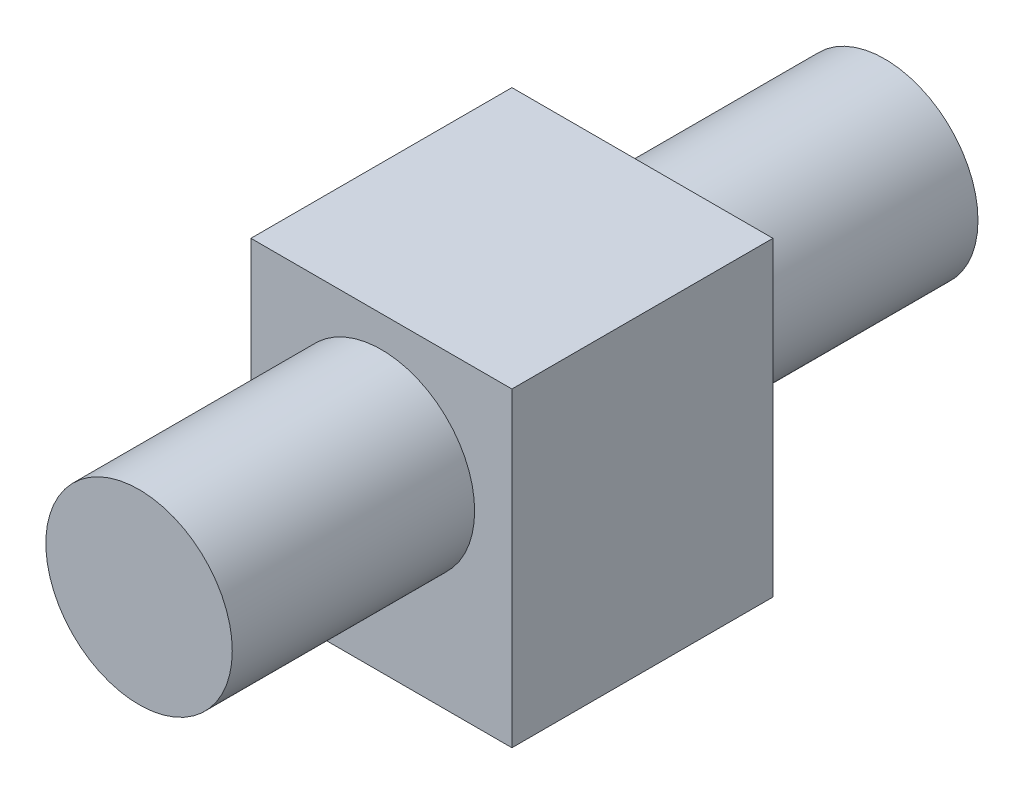
ISO-10303-21;
HEADER;
FILE_DESCRIPTION(('STEP AP214'),'2;1');
FILE_NAME('part.step','',(''),(''),'','','');
FILE_SCHEMA(('AUTOMOTIVE_DESIGN { 1 0 10303 214 1 1 1 1 }'));
ENDSEC;
DATA;
#1=APPLICATION_CONTEXT('core data for automotive mechanical design processes');
#2=APPLICATION_PROTOCOL_DEFINITION('international standard','automotive_design',2000,#1);
#3=PRODUCT_CONTEXT('',#1,'mechanical');
#4=PRODUCT('Part','Part','',(#3));
#5=PRODUCT_RELATED_PRODUCT_CATEGORY('part','',(#4));
#6=PRODUCT_DEFINITION_FORMATION('','',#4);
#7=PRODUCT_DEFINITION_CONTEXT('part definition',#1,'design');
#8=PRODUCT_DEFINITION('design','',#6,#7);
#9=PRODUCT_DEFINITION_SHAPE('','',#8);
#10=(LENGTH_UNIT() NAMED_UNIT(*) SI_UNIT(.MILLI.,.METRE.));
#11=(NAMED_UNIT(*) PLANE_ANGLE_UNIT() SI_UNIT($,.RADIAN.));
#12=(NAMED_UNIT(*) SI_UNIT($,.STERADIAN.) SOLID_ANGLE_UNIT());
#13=UNCERTAINTY_MEASURE_WITH_UNIT(LENGTH_MEASURE(1.E-05),#10,'distance_accuracy_value','');
#14=(GEOMETRIC_REPRESENTATION_CONTEXT(3) GLOBAL_UNCERTAINTY_ASSIGNED_CONTEXT((#13)) GLOBAL_UNIT_ASSIGNED_CONTEXT((#10,
#11,#12)) REPRESENTATION_CONTEXT('',''));
#15=CARTESIAN_POINT('',(0.,0.,0.));
#16=DIRECTION('',(0.,0.,1.));
#17=DIRECTION('',(1.,0.,0.));
#18=AXIS2_PLACEMENT_3D('',#15,#16,#17);
#19=CARTESIAN_POINT('',(21.,50.,21.));
#20=DIRECTION('',(-1.,0.,0.));
#21=DIRECTION('',(0.,0.,1.));
#22=AXIS2_PLACEMENT_3D('',#19,#20,#21);
#23=PLANE('',#22);
#24=DIRECTION('',(0.,0.,-1.));
#25=VECTOR('',#24,1.);
#26=CARTESIAN_POINT('',(21.,0.,21.));
#27=LINE('',#26,#25);
#28=CARTESIAN_POINT('',(21.,0.,21.));
#29=VERTEX_POINT('',#28);
#30=CARTESIAN_POINT('',(21.,0.,-21.));
#31=VERTEX_POINT('',#30);
#32=EDGE_CURVE('E102',#29,#31,#27,.T.);
#33=ORIENTED_EDGE('',*,*,#32,.T.);
#34=DIRECTION('',(0.,-1.,0.));
#35=VECTOR('',#34,1.);
#36=CARTESIAN_POINT('',(21.,50.,-21.));
#37=LINE('',#36,#35);
#38=CARTESIAN_POINT('',(21.,50.,-21.));
#39=VERTEX_POINT('',#38);
#40=EDGE_CURVE('E11',#39,#31,#37,.T.);
#41=ORIENTED_EDGE('',*,*,#40,.F.);
#42=DIRECTION('',(0.,0.,-1.));
#43=VECTOR('',#42,1.);
#44=CARTESIAN_POINT('',(21.,50.,21.));
#45=LINE('',#44,#43);
#46=CARTESIAN_POINT('',(21.,50.,21.));
#47=VERTEX_POINT('',#46);
#48=EDGE_CURVE('E93',#47,#39,#45,.T.);
#49=ORIENTED_EDGE('',*,*,#48,.F.);
#50=DIRECTION('',(0.,-1.,0.));
#51=VECTOR('',#50,1.);
#52=CARTESIAN_POINT('',(21.,50.,21.));
#53=LINE('',#52,#51);
#54=EDGE_CURVE('E99',#47,#29,#53,.T.);
#55=ORIENTED_EDGE('',*,*,#54,.T.);
#56=EDGE_LOOP('',(#33,#41,#49,#55));
#57=FACE_BOUND('',#56,.T.);
#58=ADVANCED_FACE('F39',(#57),#23,.F.);
#59=CARTESIAN_POINT('',(-21.,50.,-21.));
#60=DIRECTION('',(0.,0.,1.));
#61=DIRECTION('',(1.,0.,0.));
#62=AXIS2_PLACEMENT_3D('',#59,#60,#61);
#63=PLANE('',#62);
#64=CARTESIAN_POINT('',(0.,30.,-21.));
#65=DIRECTION('',(0.,0.,1.));
#66=DIRECTION('',(1.,0.,0.));
#67=AXIS2_PLACEMENT_3D('',#64,#65,#66);
#68=CIRCLE('',#67,15.);
#69=CARTESIAN_POINT('',(15.,30.,-21.));
#70=VERTEX_POINT('',#69);
#71=EDGE_CURVE('E110',#70,#70,#68,.T.);
#72=ORIENTED_EDGE('',*,*,#71,.T.);
#73=EDGE_LOOP('',(#72));
#74=FACE_BOUND('',#73,.T.);
#75=DIRECTION('',(-1.,0.,0.));
#76=VECTOR('',#75,1.);
#77=CARTESIAN_POINT('',(-21.,0.,-21.));
#78=LINE('',#77,#76);
#79=CARTESIAN_POINT('',(-21.,0.,-21.));
#80=VERTEX_POINT('',#79);
#81=EDGE_CURVE('E92',#31,#80,#78,.T.);
#82=ORIENTED_EDGE('',*,*,#81,.T.);
#83=DIRECTION('',(0.,-1.,0.));
#84=VECTOR('',#83,1.);
#85=CARTESIAN_POINT('',(-21.,50.,-21.));
#86=LINE('',#85,#84);
#87=CARTESIAN_POINT('',(-21.,50.,-21.));
#88=VERTEX_POINT('',#87);
#89=EDGE_CURVE('E48',#88,#80,#86,.T.);
#90=ORIENTED_EDGE('',*,*,#89,.F.);
#91=DIRECTION('',(-1.,0.,0.));
#92=VECTOR('',#91,1.);
#93=CARTESIAN_POINT('',(-21.,50.,-21.));
#94=LINE('',#93,#92);
#95=EDGE_CURVE('E88',#39,#88,#94,.T.);
#96=ORIENTED_EDGE('',*,*,#95,.F.);
#97=ORIENTED_EDGE('',*,*,#40,.T.);
#98=EDGE_LOOP('',(#82,#90,#96,#97));
#99=FACE_BOUND('',#98,.T.);
#100=ADVANCED_FACE('F94',(#74,#99),#63,.F.);
#101=CARTESIAN_POINT('',(-21.,50.,21.));
#102=DIRECTION('',(1.,0.,0.));
#103=DIRECTION('',(0.,0.,-1.));
#104=AXIS2_PLACEMENT_3D('',#101,#102,#103);
#105=PLANE('',#104);
#106=DIRECTION('',(0.,0.,1.));
#107=VECTOR('',#106,1.);
#108=CARTESIAN_POINT('',(-21.,0.,21.));
#109=LINE('',#108,#107);
#110=CARTESIAN_POINT('',(-21.,0.,21.));
#111=VERTEX_POINT('',#110);
#112=EDGE_CURVE('E71',#80,#111,#109,.T.);
#113=ORIENTED_EDGE('',*,*,#112,.T.);
#114=DIRECTION('',(0.,-1.,0.));
#115=VECTOR('',#114,1.);
#116=CARTESIAN_POINT('',(-21.,50.,21.));
#117=LINE('',#116,#115);
#118=CARTESIAN_POINT('',(-21.,50.,21.));
#119=VERTEX_POINT('',#118);
#120=EDGE_CURVE('E96',#119,#111,#117,.T.);
#121=ORIENTED_EDGE('',*,*,#120,.F.);
#122=DIRECTION('',(0.,0.,1.));
#123=VECTOR('',#122,1.);
#124=CARTESIAN_POINT('',(-21.,50.,21.));
#125=LINE('',#124,#123);
#126=EDGE_CURVE('E90',#88,#119,#125,.T.);
#127=ORIENTED_EDGE('',*,*,#126,.F.);
#128=ORIENTED_EDGE('',*,*,#89,.T.);
#129=EDGE_LOOP('',(#113,#121,#127,#128));
#130=FACE_BOUND('',#129,.T.);
#131=ADVANCED_FACE('F98',(#130),#105,.F.);
#132=CARTESIAN_POINT('',(-21.,50.,21.));
#133=DIRECTION('',(0.,0.,-1.));
#134=DIRECTION('',(-1.,0.,0.));
#135=AXIS2_PLACEMENT_3D('',#132,#133,#134);
#136=PLANE('',#135);
#137=CARTESIAN_POINT('',(0.,30.,21.));
#138=DIRECTION('',(0.,0.,-1.));
#139=DIRECTION('',(-1.,0.,0.));
#140=AXIS2_PLACEMENT_3D('',#137,#138,#139);
#141=CIRCLE('',#140,15.);
#142=CARTESIAN_POINT('',(-15.,30.,21.));
#143=VERTEX_POINT('',#142);
#144=EDGE_CURVE('E45',#143,#143,#141,.T.);
#145=ORIENTED_EDGE('',*,*,#144,.T.);
#146=EDGE_LOOP('',(#145));
#147=FACE_BOUND('',#146,.T.);
#148=DIRECTION('',(1.,0.,0.));
#149=VECTOR('',#148,1.);
#150=CARTESIAN_POINT('',(-21.,0.,21.));
#151=LINE('',#150,#149);
#152=EDGE_CURVE('E80',#111,#29,#151,.T.);
#153=ORIENTED_EDGE('',*,*,#152,.T.);
#154=ORIENTED_EDGE('',*,*,#54,.F.);
#155=DIRECTION('',(1.,0.,0.));
#156=VECTOR('',#155,1.);
#157=CARTESIAN_POINT('',(-21.,50.,21.));
#158=LINE('',#157,#156);
#159=EDGE_CURVE('E57',#119,#47,#158,.T.);
#160=ORIENTED_EDGE('',*,*,#159,.F.);
#161=ORIENTED_EDGE('',*,*,#120,.T.);
#162=EDGE_LOOP('',(#153,#154,#160,#161));
#163=FACE_BOUND('',#162,.T.);
#164=ADVANCED_FACE('F115',(#147,#163),#136,.F.);
#165=CARTESIAN_POINT('',(0.,50.,0.));
#166=DIRECTION('',(0.,-1.,0.));
#167=DIRECTION('',(0.,0.,-1.));
#168=AXIS2_PLACEMENT_3D('',#165,#166,#167);
#169=PLANE('',#168);
#170=ORIENTED_EDGE('',*,*,#48,.T.);
#171=ORIENTED_EDGE('',*,*,#95,.T.);
#172=ORIENTED_EDGE('',*,*,#126,.T.);
#173=ORIENTED_EDGE('',*,*,#159,.T.);
#174=EDGE_LOOP('',(#170,#171,#172,#173));
#175=FACE_BOUND('',#174,.T.);
#176=ADVANCED_FACE('F87',(#175),#169,.F.);
#177=CARTESIAN_POINT('',(0.,0.,0.));
#178=DIRECTION('',(0.,-1.,0.));
#179=DIRECTION('',(0.,0.,-1.));
#180=AXIS2_PLACEMENT_3D('',#177,#178,#179);
#181=PLANE('',#180);
#182=ORIENTED_EDGE('',*,*,#32,.F.);
#183=ORIENTED_EDGE('',*,*,#152,.F.);
#184=ORIENTED_EDGE('',*,*,#112,.F.);
#185=ORIENTED_EDGE('',*,*,#81,.F.);
#186=EDGE_LOOP('',(#182,#183,#184,#185));
#187=FACE_BOUND('',#186,.T.);
#188=ADVANCED_FACE('F113',(#187),#181,.T.);
#189=CARTESIAN_POINT('',(0.,30.,60.));
#190=DIRECTION('',(0.,0.,1.));
#191=DIRECTION('',(1.,0.,0.));
#192=AXIS2_PLACEMENT_3D('',#189,#190,#191);
#193=PLANE('',#192);
#194=CARTESIAN_POINT('',(0.,30.,60.));
#195=DIRECTION('',(0.,0.,1.));
#196=DIRECTION('',(1.,0.,0.));
#197=AXIS2_PLACEMENT_3D('',#194,#195,#196);
#198=CIRCLE('',#197,15.);
#199=CARTESIAN_POINT('',(15.,30.,60.));
#200=VERTEX_POINT('',#199);
#201=EDGE_CURVE('E123',#200,#200,#198,.T.);
#202=ORIENTED_EDGE('',*,*,#201,.T.);
#203=EDGE_LOOP('',(#202));
#204=FACE_BOUND('',#203,.T.);
#205=ADVANCED_FACE('F130',(#204),#193,.T.);
#206=CARTESIAN_POINT('',(0.,30.,-60.));
#207=DIRECTION('',(0.,0.,1.));
#208=DIRECTION('',(1.,0.,0.));
#209=AXIS2_PLACEMENT_3D('',#206,#207,#208);
#210=CYLINDRICAL_SURFACE('',#209,15.);
#211=ORIENTED_EDGE('',*,*,#201,.F.);
#212=EDGE_LOOP('',(#211));
#213=FACE_BOUND('',#212,.T.);
#214=ORIENTED_EDGE('',*,*,#144,.F.);
#215=EDGE_LOOP('',(#214));
#216=FACE_BOUND('',#215,.T.);
#217=ADVANCED_FACE('F129',(#213,#216),#210,.T.);
#218=CARTESIAN_POINT('',(0.,30.,-60.));
#219=DIRECTION('',(0.,0.,1.));
#220=DIRECTION('',(1.,0.,0.));
#221=AXIS2_PLACEMENT_3D('',#218,#219,#220);
#222=CIRCLE('',#221,15.);
#223=CARTESIAN_POINT('',(15.,30.,-60.));
#224=VERTEX_POINT('',#223);
#225=EDGE_CURVE('E116',#224,#224,#222,.T.);
#226=ORIENTED_EDGE('',*,*,#225,.T.);
#227=EDGE_LOOP('',(#226));
#228=FACE_BOUND('',#227,.T.);
#229=ORIENTED_EDGE('',*,*,#71,.F.);
#230=EDGE_LOOP('',(#229));
#231=FACE_BOUND('',#230,.T.);
#232=ADVANCED_FACE('F134',(#228,#231),#210,.T.);
#233=CARTESIAN_POINT('',(0.,30.,-60.));
#234=DIRECTION('',(0.,0.,1.));
#235=DIRECTION('',(1.,0.,0.));
#236=AXIS2_PLACEMENT_3D('',#233,#234,#235);
#237=PLANE('',#236);
#238=ORIENTED_EDGE('',*,*,#225,.F.);
#239=EDGE_LOOP('',(#238));
#240=FACE_BOUND('',#239,.T.);
#241=ADVANCED_FACE('F158',(#240),#237,.F.);
#242=CLOSED_SHELL('',(#58,#100,#131,#164,#176,#188,#205,#217,#232,#241));
#243=MANIFOLD_SOLID_BREP('B2',#242);
#244=ADVANCED_BREP_SHAPE_REPRESENTATION('',(#18,#243),#14);
#245=SHAPE_DEFINITION_REPRESENTATION(#9,#244);
ENDSEC;
END-ISO-10303-21;
